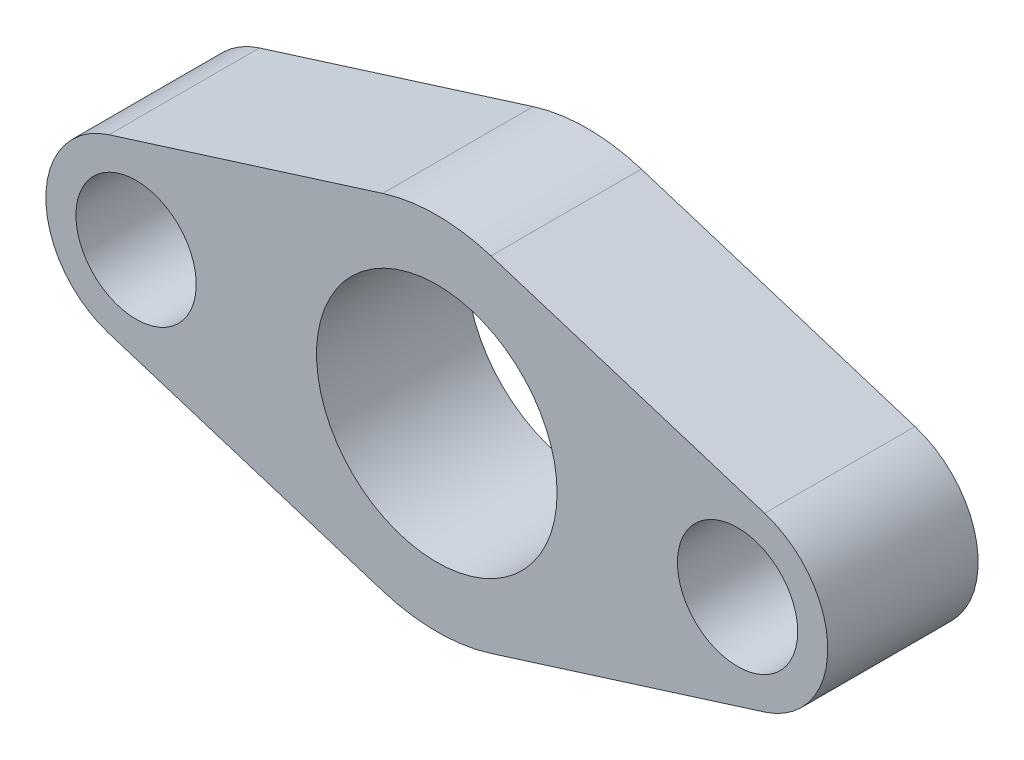
ISO-10303-21;
HEADER;
FILE_DESCRIPTION(('STEP AP214'),'2;1');
FILE_NAME('part.step','',(''),(''),'','','');
FILE_SCHEMA(('AUTOMOTIVE_DESIGN { 1 0 10303 214 1 1 1 1 }'));
ENDSEC;
DATA;
#1=APPLICATION_CONTEXT('core data for automotive mechanical design processes');
#2=APPLICATION_PROTOCOL_DEFINITION('international standard','automotive_design',2000,#1);
#3=PRODUCT_CONTEXT('',#1,'mechanical');
#4=PRODUCT('Part','Part','',(#3));
#5=PRODUCT_RELATED_PRODUCT_CATEGORY('part','',(#4));
#6=PRODUCT_DEFINITION_FORMATION('','',#4);
#7=PRODUCT_DEFINITION_CONTEXT('part definition',#1,'design');
#8=PRODUCT_DEFINITION('design','',#6,#7);
#9=PRODUCT_DEFINITION_SHAPE('','',#8);
#10=(LENGTH_UNIT() NAMED_UNIT(*) SI_UNIT(.MILLI.,.METRE.));
#11=(NAMED_UNIT(*) PLANE_ANGLE_UNIT() SI_UNIT($,.RADIAN.));
#12=(NAMED_UNIT(*) SI_UNIT($,.STERADIAN.) SOLID_ANGLE_UNIT());
#13=UNCERTAINTY_MEASURE_WITH_UNIT(LENGTH_MEASURE(1.E-05),#10,'distance_accuracy_value','');
#14=(GEOMETRIC_REPRESENTATION_CONTEXT(3) GLOBAL_UNCERTAINTY_ASSIGNED_CONTEXT((#13)) GLOBAL_UNIT_ASSIGNED_CONTEXT((#10,
#11,#12)) REPRESENTATION_CONTEXT('',''));
#15=CARTESIAN_POINT('',(0.,0.,0.));
#16=DIRECTION('',(0.,0.,1.));
#17=DIRECTION('',(1.,0.,0.));
#18=AXIS2_PLACEMENT_3D('',#15,#16,#17);
#19=CARTESIAN_POINT('',(29.9999999999999,50.,12.5));
#20=DIRECTION('',(0.,0.,-1.));
#21=DIRECTION('',(-1.,0.,0.));
#22=AXIS2_PLACEMENT_3D('',#19,#20,#21);
#23=PLANE('',#22);
#24=CARTESIAN_POINT('',(29.9999999999999,50.,12.5));
#25=DIRECTION('',(0.,0.,1.));
#26=DIRECTION('',(-1.,0.,0.));
#27=AXIS2_PLACEMENT_3D('',#24,#25,#26);
#28=CIRCLE('',#27,15.);
#29=CARTESIAN_POINT('',(25.4999999999999,64.3090880212542,12.5));
#30=VERTEX_POINT('',#29);
#31=CARTESIAN_POINT('',(25.4999999999999,35.6909119787458,12.5));
#32=VERTEX_POINT('',#31);
#33=EDGE_CURVE('E149',#30,#32,#28,.T.);
#34=ORIENTED_EDGE('',*,*,#33,.T.);
#35=DIRECTION('',(0.953939201416946,-0.299999999999999,0.));
#36=VECTOR('',#35,1.);
#37=CARTESIAN_POINT('',(71.,21.3818239574916,12.5));
#38=LINE('',#37,#36);
#39=CARTESIAN_POINT('',(71.,21.3818239574916,12.5));
#40=VERTEX_POINT('',#39);
#41=EDGE_CURVE('E97',#32,#40,#38,.T.);
#42=ORIENTED_EDGE('',*,*,#41,.T.);
#43=CARTESIAN_POINT('',(80.,50.,12.5));
#44=DIRECTION('',(0.,0.,1.));
#45=DIRECTION('',(1.,0.,0.));
#46=AXIS2_PLACEMENT_3D('',#43,#44,#45);
#47=CIRCLE('',#46,30.);
#48=CARTESIAN_POINT('',(88.9999999999999,21.3818239574916,12.5));
#49=VERTEX_POINT('',#48);
#50=EDGE_CURVE('E164',#40,#49,#47,.T.);
#51=ORIENTED_EDGE('',*,*,#50,.T.);
#52=DIRECTION('',(0.953939201416946,0.299999999999999,0.));
#53=VECTOR('',#52,1.);
#54=CARTESIAN_POINT('',(89.,21.3818239574916,12.5));
#55=LINE('',#54,#53);
#56=CARTESIAN_POINT('',(134.5,35.6909119787458,12.5));
#57=VERTEX_POINT('',#56);
#58=EDGE_CURVE('E177',#49,#57,#55,.T.);
#59=ORIENTED_EDGE('',*,*,#58,.T.);
#60=CARTESIAN_POINT('',(130.,50.,12.5));
#61=DIRECTION('',(0.,0.,1.));
#62=DIRECTION('',(1.,0.,0.));
#63=AXIS2_PLACEMENT_3D('',#60,#61,#62);
#64=CIRCLE('',#63,15.);
#65=CARTESIAN_POINT('',(134.5,64.3090880212542,12.5));
#66=VERTEX_POINT('',#65);
#67=EDGE_CURVE('E116',#57,#66,#64,.T.);
#68=ORIENTED_EDGE('',*,*,#67,.T.);
#69=DIRECTION('',(-0.953939201416946,0.299999999999999,0.));
#70=VECTOR('',#69,1.);
#71=CARTESIAN_POINT('',(134.5,64.3090880212542,12.5));
#72=LINE('',#71,#70);
#73=CARTESIAN_POINT('',(88.9999999999999,78.6181760425084,12.5));
#74=VERTEX_POINT('',#73);
#75=EDGE_CURVE('E110',#66,#74,#72,.T.);
#76=ORIENTED_EDGE('',*,*,#75,.T.);
#77=CARTESIAN_POINT('',(80.,50.,12.5));
#78=DIRECTION('',(0.,0.,1.));
#79=DIRECTION('',(1.,0.,0.));
#80=AXIS2_PLACEMENT_3D('',#77,#78,#79);
#81=CIRCLE('',#80,30.);
#82=CARTESIAN_POINT('',(71.,78.6181760425084,12.5));
#83=VERTEX_POINT('',#82);
#84=EDGE_CURVE('E114',#74,#83,#81,.T.);
#85=ORIENTED_EDGE('',*,*,#84,.T.);
#86=DIRECTION('',(-0.953939201416946,-0.299999999999999,0.));
#87=VECTOR('',#86,1.);
#88=CARTESIAN_POINT('',(25.4999999999999,64.3090880212542,12.5));
#89=LINE('',#88,#87);
#90=EDGE_CURVE('E54',#83,#30,#89,.T.);
#91=ORIENTED_EDGE('',*,*,#90,.T.);
#92=EDGE_LOOP('',(#34,#42,#51,#59,#68,#76,#85,#91));
#93=FACE_BOUND('',#92,.T.);
#94=CARTESIAN_POINT('',(80.,50.,12.5));
#95=DIRECTION('',(0.,0.,1.));
#96=DIRECTION('',(1.,0.,0.));
#97=AXIS2_PLACEMENT_3D('',#94,#95,#96);
#98=CIRCLE('',#97,20.);
#99=CARTESIAN_POINT('',(100.,50.,12.5));
#100=VERTEX_POINT('',#99);
#101=EDGE_CURVE('E138',#100,#100,#98,.T.);
#102=ORIENTED_EDGE('',*,*,#101,.F.);
#103=EDGE_LOOP('',(#102));
#104=FACE_BOUND('',#103,.T.);
#105=CARTESIAN_POINT('',(130.,50.,12.5));
#106=DIRECTION('',(0.,0.,1.));
#107=DIRECTION('',(1.,0.,0.));
#108=AXIS2_PLACEMENT_3D('',#105,#106,#107);
#109=CIRCLE('',#108,10.);
#110=CARTESIAN_POINT('',(140.,50.,12.5));
#111=VERTEX_POINT('',#110);
#112=EDGE_CURVE('E186',#111,#111,#109,.T.);
#113=ORIENTED_EDGE('',*,*,#112,.F.);
#114=EDGE_LOOP('',(#113));
#115=FACE_BOUND('',#114,.T.);
#116=CARTESIAN_POINT('',(29.9999999999999,50.,12.5));
#117=DIRECTION('',(0.,0.,1.));
#118=DIRECTION('',(-1.,0.,0.));
#119=AXIS2_PLACEMENT_3D('',#116,#117,#118);
#120=CIRCLE('',#119,10.);
#121=CARTESIAN_POINT('',(19.9999999999999,50.,12.5));
#122=VERTEX_POINT('',#121);
#123=EDGE_CURVE('E192',#122,#122,#120,.T.);
#124=ORIENTED_EDGE('',*,*,#123,.F.);
#125=EDGE_LOOP('',(#124));
#126=FACE_BOUND('',#125,.T.);
#127=ADVANCED_FACE('F37',(#93,#104,#115,#126),#23,.F.);
#128=CARTESIAN_POINT('',(29.9999999999999,50.,-12.5));
#129=DIRECTION('',(0.,0.,-1.));
#130=DIRECTION('',(-1.,0.,0.));
#131=AXIS2_PLACEMENT_3D('',#128,#129,#130);
#132=PLANE('',#131);
#133=CARTESIAN_POINT('',(130.,50.,-12.5));
#134=DIRECTION('',(0.,0.,1.));
#135=DIRECTION('',(1.,0.,0.));
#136=AXIS2_PLACEMENT_3D('',#133,#134,#135);
#137=CIRCLE('',#136,10.);
#138=CARTESIAN_POINT('',(140.,50.,-12.5));
#139=VERTEX_POINT('',#138);
#140=EDGE_CURVE('E189',#139,#139,#137,.T.);
#141=ORIENTED_EDGE('',*,*,#140,.T.);
#142=EDGE_LOOP('',(#141));
#143=FACE_BOUND('',#142,.T.);
#144=CARTESIAN_POINT('',(29.9999999999999,50.,-12.5));
#145=DIRECTION('',(0.,0.,1.));
#146=DIRECTION('',(-1.,0.,0.));
#147=AXIS2_PLACEMENT_3D('',#144,#145,#146);
#148=CIRCLE('',#147,15.);
#149=CARTESIAN_POINT('',(25.4999999999999,64.3090880212542,-12.5));
#150=VERTEX_POINT('',#149);
#151=CARTESIAN_POINT('',(25.4999999999999,35.6909119787458,-12.5));
#152=VERTEX_POINT('',#151);
#153=EDGE_CURVE('E134',#150,#152,#148,.T.);
#154=ORIENTED_EDGE('',*,*,#153,.F.);
#155=DIRECTION('',(-0.953939201416946,-0.299999999999999,0.));
#156=VECTOR('',#155,1.);
#157=CARTESIAN_POINT('',(25.4999999999999,64.3090880212542,-12.5));
#158=LINE('',#157,#156);
#159=CARTESIAN_POINT('',(71.,78.6181760425084,-12.5));
#160=VERTEX_POINT('',#159);
#161=EDGE_CURVE('E89',#160,#150,#158,.T.);
#162=ORIENTED_EDGE('',*,*,#161,.F.);
#163=CARTESIAN_POINT('',(80.,50.,-12.5));
#164=DIRECTION('',(0.,0.,1.));
#165=DIRECTION('',(1.,0.,0.));
#166=AXIS2_PLACEMENT_3D('',#163,#164,#165);
#167=CIRCLE('',#166,30.);
#168=CARTESIAN_POINT('',(88.9999999999999,78.6181760425084,-12.5));
#169=VERTEX_POINT('',#168);
#170=EDGE_CURVE('E83',#169,#160,#167,.T.);
#171=ORIENTED_EDGE('',*,*,#170,.F.);
#172=DIRECTION('',(-0.953939201416946,0.299999999999999,0.));
#173=VECTOR('',#172,1.);
#174=CARTESIAN_POINT('',(134.5,64.3090880212542,-12.5));
#175=LINE('',#174,#173);
#176=CARTESIAN_POINT('',(134.5,64.3090880212542,-12.5));
#177=VERTEX_POINT('',#176);
#178=EDGE_CURVE('E124',#177,#169,#175,.T.);
#179=ORIENTED_EDGE('',*,*,#178,.F.);
#180=CARTESIAN_POINT('',(130.,50.,-12.5));
#181=DIRECTION('',(0.,0.,1.));
#182=DIRECTION('',(1.,0.,0.));
#183=AXIS2_PLACEMENT_3D('',#180,#181,#182);
#184=CIRCLE('',#183,15.);
#185=CARTESIAN_POINT('',(134.5,35.6909119787458,-12.5));
#186=VERTEX_POINT('',#185);
#187=EDGE_CURVE('E144',#186,#177,#184,.T.);
#188=ORIENTED_EDGE('',*,*,#187,.F.);
#189=DIRECTION('',(0.953939201416946,0.299999999999999,0.));
#190=VECTOR('',#189,1.);
#191=CARTESIAN_POINT('',(89.,21.3818239574916,-12.5));
#192=LINE('',#191,#190);
#193=CARTESIAN_POINT('',(88.9999999999999,21.3818239574916,-12.5));
#194=VERTEX_POINT('',#193);
#195=EDGE_CURVE('E142',#194,#186,#192,.T.);
#196=ORIENTED_EDGE('',*,*,#195,.F.);
#197=CARTESIAN_POINT('',(80.,50.,-12.5));
#198=DIRECTION('',(0.,0.,1.));
#199=DIRECTION('',(1.,0.,0.));
#200=AXIS2_PLACEMENT_3D('',#197,#198,#199);
#201=CIRCLE('',#200,30.);
#202=CARTESIAN_POINT('',(71.,21.3818239574916,-12.5));
#203=VERTEX_POINT('',#202);
#204=EDGE_CURVE('E140',#203,#194,#201,.T.);
#205=ORIENTED_EDGE('',*,*,#204,.F.);
#206=DIRECTION('',(0.953939201416946,-0.299999999999999,0.));
#207=VECTOR('',#206,1.);
#208=CARTESIAN_POINT('',(71.,21.3818239574916,-12.5));
#209=LINE('',#208,#207);
#210=EDGE_CURVE('E137',#152,#203,#209,.T.);
#211=ORIENTED_EDGE('',*,*,#210,.F.);
#212=EDGE_LOOP('',(#154,#162,#171,#179,#188,#196,#205,#211));
#213=FACE_BOUND('',#212,.T.);
#214=CARTESIAN_POINT('',(80.,50.,-12.5));
#215=DIRECTION('',(0.,0.,1.));
#216=DIRECTION('',(1.,0.,0.));
#217=AXIS2_PLACEMENT_3D('',#214,#215,#216);
#218=CIRCLE('',#217,20.);
#219=CARTESIAN_POINT('',(100.,50.,-12.5));
#220=VERTEX_POINT('',#219);
#221=EDGE_CURVE('E183',#220,#220,#218,.T.);
#222=ORIENTED_EDGE('',*,*,#221,.T.);
#223=EDGE_LOOP('',(#222));
#224=FACE_BOUND('',#223,.T.);
#225=CARTESIAN_POINT('',(29.9999999999999,50.,-12.5));
#226=DIRECTION('',(0.,0.,1.));
#227=DIRECTION('',(-1.,0.,0.));
#228=AXIS2_PLACEMENT_3D('',#225,#226,#227);
#229=CIRCLE('',#228,10.);
#230=CARTESIAN_POINT('',(19.9999999999999,50.,-12.5));
#231=VERTEX_POINT('',#230);
#232=EDGE_CURVE('E195',#231,#231,#229,.T.);
#233=ORIENTED_EDGE('',*,*,#232,.T.);
#234=EDGE_LOOP('',(#233));
#235=FACE_BOUND('',#234,.T.);
#236=ADVANCED_FACE('F168',(#143,#213,#224,#235),#132,.T.);
#237=CARTESIAN_POINT('',(29.9999999999999,50.,12.5));
#238=DIRECTION('',(0.,0.,-1.));
#239=DIRECTION('',(-1.,0.,0.));
#240=AXIS2_PLACEMENT_3D('',#237,#238,#239);
#241=CYLINDRICAL_SURFACE('',#240,15.);
#242=ORIENTED_EDGE('',*,*,#153,.T.);
#243=DIRECTION('',(0.,0.,-1.));
#244=VECTOR('',#243,1.);
#245=CARTESIAN_POINT('',(25.4999999999999,35.6909119787458,12.5));
#246=LINE('',#245,#244);
#247=EDGE_CURVE('E11',#32,#152,#246,.T.);
#248=ORIENTED_EDGE('',*,*,#247,.F.);
#249=ORIENTED_EDGE('',*,*,#33,.F.);
#250=DIRECTION('',(0.,0.,-1.));
#251=VECTOR('',#250,1.);
#252=CARTESIAN_POINT('',(25.4999999999999,64.3090880212542,12.5));
#253=LINE('',#252,#251);
#254=EDGE_CURVE('E130',#30,#150,#253,.T.);
#255=ORIENTED_EDGE('',*,*,#254,.T.);
#256=EDGE_LOOP('',(#242,#248,#249,#255));
#257=FACE_BOUND('',#256,.T.);
#258=ADVANCED_FACE('F39',(#257),#241,.T.);
#259=CARTESIAN_POINT('',(71.,21.3818239574916,12.5));
#260=DIRECTION('',(0.299999999999999,0.953939201416946,0.));
#261=DIRECTION('',(-0.953939201416946,0.299999999999999,0.));
#262=AXIS2_PLACEMENT_3D('',#259,#260,#261);
#263=PLANE('',#262);
#264=ORIENTED_EDGE('',*,*,#210,.T.);
#265=DIRECTION('',(0.,0.,-1.));
#266=VECTOR('',#265,1.);
#267=CARTESIAN_POINT('',(71.,21.3818239574916,12.5));
#268=LINE('',#267,#266);
#269=EDGE_CURVE('E46',#40,#203,#268,.T.);
#270=ORIENTED_EDGE('',*,*,#269,.F.);
#271=ORIENTED_EDGE('',*,*,#41,.F.);
#272=ORIENTED_EDGE('',*,*,#247,.T.);
#273=EDGE_LOOP('',(#264,#270,#271,#272));
#274=FACE_BOUND('',#273,.T.);
#275=ADVANCED_FACE('F227',(#274),#263,.F.);
#276=CARTESIAN_POINT('',(80.,50.,12.5));
#277=DIRECTION('',(0.,0.,-1.));
#278=DIRECTION('',(-1.,0.,0.));
#279=AXIS2_PLACEMENT_3D('',#276,#277,#278);
#280=CYLINDRICAL_SURFACE('',#279,30.);
#281=ORIENTED_EDGE('',*,*,#204,.T.);
#282=DIRECTION('',(0.,0.,-1.));
#283=VECTOR('',#282,1.);
#284=CARTESIAN_POINT('',(88.9999999999999,21.3818239574916,12.5));
#285=LINE('',#284,#283);
#286=EDGE_CURVE('E156',#49,#194,#285,.T.);
#287=ORIENTED_EDGE('',*,*,#286,.F.);
#288=ORIENTED_EDGE('',*,*,#50,.F.);
#289=ORIENTED_EDGE('',*,*,#269,.T.);
#290=EDGE_LOOP('',(#281,#287,#288,#289));
#291=FACE_BOUND('',#290,.T.);
#292=ADVANCED_FACE('F162',(#291),#280,.T.);
#293=CARTESIAN_POINT('',(89.,21.3818239574916,12.5));
#294=DIRECTION('',(-0.299999999999999,0.953939201416946,0.));
#295=DIRECTION('',(-0.953939201416946,-0.299999999999999,0.));
#296=AXIS2_PLACEMENT_3D('',#293,#294,#295);
#297=PLANE('',#296);
#298=ORIENTED_EDGE('',*,*,#195,.T.);
#299=DIRECTION('',(0.,0.,-1.));
#300=VECTOR('',#299,1.);
#301=CARTESIAN_POINT('',(134.5,35.6909119787458,12.5));
#302=LINE('',#301,#300);
#303=EDGE_CURVE('E153',#57,#186,#302,.T.);
#304=ORIENTED_EDGE('',*,*,#303,.F.);
#305=ORIENTED_EDGE('',*,*,#58,.F.);
#306=ORIENTED_EDGE('',*,*,#286,.T.);
#307=EDGE_LOOP('',(#298,#304,#305,#306));
#308=FACE_BOUND('',#307,.T.);
#309=ADVANCED_FACE('F173',(#308),#297,.F.);
#310=CARTESIAN_POINT('',(130.,50.,12.5));
#311=DIRECTION('',(0.,0.,-1.));
#312=DIRECTION('',(-1.,0.,0.));
#313=AXIS2_PLACEMENT_3D('',#310,#311,#312);
#314=CYLINDRICAL_SURFACE('',#313,15.);
#315=ORIENTED_EDGE('',*,*,#187,.T.);
#316=DIRECTION('',(0.,0.,-1.));
#317=VECTOR('',#316,1.);
#318=CARTESIAN_POINT('',(134.5,64.3090880212542,12.5));
#319=LINE('',#318,#317);
#320=EDGE_CURVE('E125',#66,#177,#319,.T.);
#321=ORIENTED_EDGE('',*,*,#320,.F.);
#322=ORIENTED_EDGE('',*,*,#67,.F.);
#323=ORIENTED_EDGE('',*,*,#303,.T.);
#324=EDGE_LOOP('',(#315,#321,#322,#323));
#325=FACE_BOUND('',#324,.T.);
#326=ADVANCED_FACE('F176',(#325),#314,.T.);
#327=CARTESIAN_POINT('',(134.5,64.3090880212542,12.5));
#328=DIRECTION('',(-0.299999999999999,-0.953939201416946,0.));
#329=DIRECTION('',(0.953939201416946,-0.299999999999999,0.));
#330=AXIS2_PLACEMENT_3D('',#327,#328,#329);
#331=PLANE('',#330);
#332=ORIENTED_EDGE('',*,*,#178,.T.);
#333=DIRECTION('',(0.,0.,-1.));
#334=VECTOR('',#333,1.);
#335=CARTESIAN_POINT('',(88.9999999999999,78.6181760425084,12.5));
#336=LINE('',#335,#334);
#337=EDGE_CURVE('E121',#74,#169,#336,.T.);
#338=ORIENTED_EDGE('',*,*,#337,.F.);
#339=ORIENTED_EDGE('',*,*,#75,.F.);
#340=ORIENTED_EDGE('',*,*,#320,.T.);
#341=EDGE_LOOP('',(#332,#338,#339,#340));
#342=FACE_BOUND('',#341,.T.);
#343=ADVANCED_FACE('F122',(#342),#331,.F.);
#344=CARTESIAN_POINT('',(80.,50.,12.5));
#345=DIRECTION('',(0.,0.,-1.));
#346=DIRECTION('',(-1.,0.,0.));
#347=AXIS2_PLACEMENT_3D('',#344,#345,#346);
#348=CYLINDRICAL_SURFACE('',#347,30.);
#349=ORIENTED_EDGE('',*,*,#170,.T.);
#350=DIRECTION('',(0.,0.,-1.));
#351=VECTOR('',#350,1.);
#352=CARTESIAN_POINT('',(71.,78.6181760425084,12.5));
#353=LINE('',#352,#351);
#354=EDGE_CURVE('E126',#83,#160,#353,.T.);
#355=ORIENTED_EDGE('',*,*,#354,.F.);
#356=ORIENTED_EDGE('',*,*,#84,.F.);
#357=ORIENTED_EDGE('',*,*,#337,.T.);
#358=EDGE_LOOP('',(#349,#355,#356,#357));
#359=FACE_BOUND('',#358,.T.);
#360=ADVANCED_FACE('F128',(#359),#348,.T.);
#361=CARTESIAN_POINT('',(25.4999999999999,64.3090880212542,12.5));
#362=DIRECTION('',(0.299999999999999,-0.953939201416946,0.));
#363=DIRECTION('',(0.953939201416946,0.299999999999999,0.));
#364=AXIS2_PLACEMENT_3D('',#361,#362,#363);
#365=PLANE('',#364);
#366=ORIENTED_EDGE('',*,*,#161,.T.);
#367=ORIENTED_EDGE('',*,*,#254,.F.);
#368=ORIENTED_EDGE('',*,*,#90,.F.);
#369=ORIENTED_EDGE('',*,*,#354,.T.);
#370=EDGE_LOOP('',(#366,#367,#368,#369));
#371=FACE_BOUND('',#370,.T.);
#372=ADVANCED_FACE('F215',(#371),#365,.F.);
#373=CARTESIAN_POINT('',(80.,50.,12.5));
#374=DIRECTION('',(0.,0.,-1.));
#375=DIRECTION('',(-1.,0.,0.));
#376=AXIS2_PLACEMENT_3D('',#373,#374,#375);
#377=CYLINDRICAL_SURFACE('',#376,20.);
#378=ORIENTED_EDGE('',*,*,#101,.T.);
#379=EDGE_LOOP('',(#378));
#380=FACE_BOUND('',#379,.T.);
#381=ORIENTED_EDGE('',*,*,#221,.F.);
#382=EDGE_LOOP('',(#381));
#383=FACE_BOUND('',#382,.T.);
#384=ADVANCED_FACE('F212',(#380,#383),#377,.F.);
#385=CARTESIAN_POINT('',(130.,50.,12.5));
#386=DIRECTION('',(0.,0.,-1.));
#387=DIRECTION('',(-1.,0.,0.));
#388=AXIS2_PLACEMENT_3D('',#385,#386,#387);
#389=CYLINDRICAL_SURFACE('',#388,10.);
#390=ORIENTED_EDGE('',*,*,#112,.T.);
#391=EDGE_LOOP('',(#390));
#392=FACE_BOUND('',#391,.T.);
#393=ORIENTED_EDGE('',*,*,#140,.F.);
#394=EDGE_LOOP('',(#393));
#395=FACE_BOUND('',#394,.T.);
#396=ADVANCED_FACE('F303',(#392,#395),#389,.F.);
#397=CARTESIAN_POINT('',(29.9999999999999,50.,12.5));
#398=DIRECTION('',(0.,0.,-1.));
#399=DIRECTION('',(-1.,0.,0.));
#400=AXIS2_PLACEMENT_3D('',#397,#398,#399);
#401=CYLINDRICAL_SURFACE('',#400,10.);
#402=ORIENTED_EDGE('',*,*,#123,.T.);
#403=EDGE_LOOP('',(#402));
#404=FACE_BOUND('',#403,.T.);
#405=ORIENTED_EDGE('',*,*,#232,.F.);
#406=EDGE_LOOP('',(#405));
#407=FACE_BOUND('',#406,.T.);
#408=ADVANCED_FACE('F201',(#404,#407),#401,.F.);
#409=CLOSED_SHELL('',(#127,#236,#258,#275,#292,#309,#326,#343,#360,#372,#384,#396,#408));
#410=MANIFOLD_SOLID_BREP('B2',#409);
#411=ADVANCED_BREP_SHAPE_REPRESENTATION('',(#18,#410),#14);
#412=SHAPE_DEFINITION_REPRESENTATION(#9,#411);
ENDSEC;
END-ISO-10303-21;
